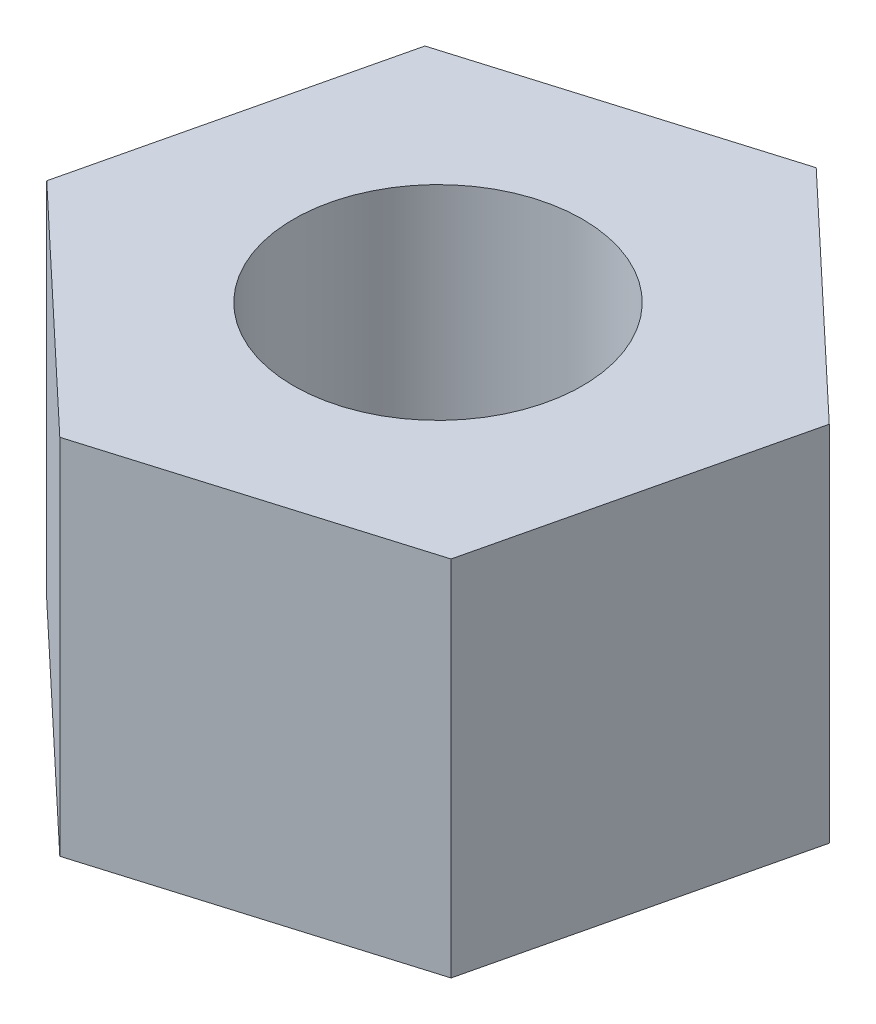
ISO-10303-21;
HEADER;
FILE_DESCRIPTION(('STEP AP214'),'2;1');
FILE_NAME('part.step','',(''),(''),'','','');
FILE_SCHEMA(('AUTOMOTIVE_DESIGN { 1 0 10303 214 1 1 1 1 }'));
ENDSEC;
DATA;
#1=APPLICATION_CONTEXT('core data for automotive mechanical design processes');
#2=APPLICATION_PROTOCOL_DEFINITION('international standard','automotive_design',2000,#1);
#3=PRODUCT_CONTEXT('',#1,'mechanical');
#4=PRODUCT('Part','Part','',(#3));
#5=PRODUCT_RELATED_PRODUCT_CATEGORY('part','',(#4));
#6=PRODUCT_DEFINITION_FORMATION('','',#4);
#7=PRODUCT_DEFINITION_CONTEXT('part definition',#1,'design');
#8=PRODUCT_DEFINITION('design','',#6,#7);
#9=PRODUCT_DEFINITION_SHAPE('','',#8);
#10=(LENGTH_UNIT() NAMED_UNIT(*) SI_UNIT(.MILLI.,.METRE.));
#11=(NAMED_UNIT(*) PLANE_ANGLE_UNIT() SI_UNIT($,.RADIAN.));
#12=(NAMED_UNIT(*) SI_UNIT($,.STERADIAN.) SOLID_ANGLE_UNIT());
#13=UNCERTAINTY_MEASURE_WITH_UNIT(LENGTH_MEASURE(1.E-05),#10,'distance_accuracy_value','');
#14=(GEOMETRIC_REPRESENTATION_CONTEXT(3) GLOBAL_UNCERTAINTY_ASSIGNED_CONTEXT((#13)) GLOBAL_UNIT_ASSIGNED_CONTEXT((#10,
#11,#12)) REPRESENTATION_CONTEXT('',''));
#15=CARTESIAN_POINT('',(0.,0.,0.));
#16=DIRECTION('',(0.,0.,1.));
#17=DIRECTION('',(1.,0.,0.));
#18=AXIS2_PLACEMENT_3D('',#15,#16,#17);
#19=CARTESIAN_POINT('',(-14.1600665091163,6.35,0.435661310979104));
#20=DIRECTION('',(-0.287104474936416,0.,-0.957899274700365));
#21=DIRECTION('',(-0.957899274700365,0.,0.287104474936416));
#22=AXIS2_PLACEMENT_3D('',#19,#20,#21);
#23=PLANE('',#22);
#24=DIRECTION('',(0.957899274700365,0.,-0.287104474936416));
#25=VECTOR('',#24,1.);
#26=CARTESIAN_POINT('',(-14.1600665091163,0.,0.435661310979104));
#27=LINE('',#26,#25);
#28=CARTESIAN_POINT('',(-14.1600665091163,0.,0.435661310979104));
#29=VERTEX_POINT('',#28);
#30=CARTESIAN_POINT('',(-8.89232808501804,0.,-1.14320122112396));
#31=VERTEX_POINT('',#30);
#32=EDGE_CURVE('E120',#29,#31,#27,.T.);
#33=ORIENTED_EDGE('',*,*,#32,.T.);
#34=DIRECTION('',(0.,-1.,0.));
#35=VECTOR('',#34,1.);
#36=CARTESIAN_POINT('',(-8.89232808501804,6.35,-1.14320122112396));
#37=LINE('',#36,#35);
#38=CARTESIAN_POINT('',(-8.89232808501804,6.35,-1.14320122112396));
#39=VERTEX_POINT('',#38);
#40=EDGE_CURVE('E11',#39,#31,#37,.T.);
#41=ORIENTED_EDGE('',*,*,#40,.F.);
#42=DIRECTION('',(0.957899274700365,0.,-0.287104474936416));
#43=VECTOR('',#42,1.);
#44=CARTESIAN_POINT('',(-14.1600665091163,6.35,0.435661310979104));
#45=LINE('',#44,#43);
#46=CARTESIAN_POINT('',(-14.1600665091163,6.35,0.435661310979104));
#47=VERTEX_POINT('',#46);
#48=EDGE_CURVE('E131',#47,#39,#45,.T.);
#49=ORIENTED_EDGE('',*,*,#48,.F.);
#50=DIRECTION('',(0.,-1.,0.));
#51=VECTOR('',#50,1.);
#52=CARTESIAN_POINT('',(-14.1600665091163,6.35,0.435661310979104));
#53=LINE('',#52,#51);
#54=EDGE_CURVE('E116',#47,#29,#53,.T.);
#55=ORIENTED_EDGE('',*,*,#54,.T.);
#56=EDGE_LOOP('',(#33,#41,#49,#55));
#57=FACE_BOUND('',#56,.T.);
#58=ADVANCED_FACE('F36',(#57),#23,.F.);
#59=CARTESIAN_POINT('',(-8.89232808501804,6.35,-1.14320122112396));
#60=DIRECTION('',(-0.973117343625412,0.,-0.230309868515055));
#61=DIRECTION('',(-0.230309868515055,0.,0.973117343625412));
#62=AXIS2_PLACEMENT_3D('',#59,#60,#61);
#63=PLANE('',#62);
#64=DIRECTION('',(0.230309868515055,0.,-0.973117343625412));
#65=VECTOR('',#64,1.);
#66=CARTESIAN_POINT('',(-8.89232808501804,0.,-1.14320122112396));
#67=LINE('',#66,#65);
#68=CARTESIAN_POINT('',(-7.62579393485359,0.,-6.49462778293599));
#69=VERTEX_POINT('',#68);
#70=EDGE_CURVE('E123',#31,#69,#67,.T.);
#71=ORIENTED_EDGE('',*,*,#70,.T.);
#72=DIRECTION('',(0.,-1.,0.));
#73=VECTOR('',#72,1.);
#74=CARTESIAN_POINT('',(-7.62579393485359,6.35,-6.49462778293599));
#75=LINE('',#74,#73);
#76=CARTESIAN_POINT('',(-7.62579393485359,6.35,-6.49462778293599));
#77=VERTEX_POINT('',#76);
#78=EDGE_CURVE('E44',#77,#69,#75,.T.);
#79=ORIENTED_EDGE('',*,*,#78,.F.);
#80=DIRECTION('',(0.230309868515055,0.,-0.973117343625412));
#81=VECTOR('',#80,1.);
#82=CARTESIAN_POINT('',(-8.89232808501804,6.35,-1.14320122112396));
#83=LINE('',#82,#81);
#84=EDGE_CURVE('E89',#39,#77,#83,.T.);
#85=ORIENTED_EDGE('',*,*,#84,.F.);
#86=ORIENTED_EDGE('',*,*,#40,.T.);
#87=EDGE_LOOP('',(#71,#79,#85,#86));
#88=FACE_BOUND('',#87,.T.);
#89=ADVANCED_FACE('F156',(#88),#63,.F.);
#90=CARTESIAN_POINT('',(-7.62579393485359,6.35,-6.49462778293599));
#91=DIRECTION('',(-0.686012868688996,0.,0.727589406185311));
#92=DIRECTION('',(0.727589406185311,0.,0.686012868688996));
#93=AXIS2_PLACEMENT_3D('',#90,#91,#92);
#94=PLANE('',#93);
#95=DIRECTION('',(-0.727589406185311,0.,-0.686012868688996));
#96=VECTOR('',#95,1.);
#97=CARTESIAN_POINT('',(-7.62579393485359,0.,-6.49462778293599));
#98=LINE('',#97,#96);
#99=CARTESIAN_POINT('',(-11.6269982087874,0.,-10.2671918126449));
#100=VERTEX_POINT('',#99);
#101=EDGE_CURVE('E126',#69,#100,#98,.T.);
#102=ORIENTED_EDGE('',*,*,#101,.T.);
#103=DIRECTION('',(0.,-1.,0.));
#104=VECTOR('',#103,1.);
#105=CARTESIAN_POINT('',(-11.6269982087874,6.35,-10.2671918126449));
#106=LINE('',#105,#104);
#107=CARTESIAN_POINT('',(-11.6269982087874,6.35,-10.2671918126449));
#108=VERTEX_POINT('',#107);
#109=EDGE_CURVE('E111',#108,#100,#106,.T.);
#110=ORIENTED_EDGE('',*,*,#109,.F.);
#111=DIRECTION('',(-0.727589406185311,0.,-0.686012868688996));
#112=VECTOR('',#111,1.);
#113=CARTESIAN_POINT('',(-7.62579393485359,6.35,-6.49462778293599));
#114=LINE('',#113,#112);
#115=EDGE_CURVE('E102',#77,#108,#114,.T.);
#116=ORIENTED_EDGE('',*,*,#115,.F.);
#117=ORIENTED_EDGE('',*,*,#78,.T.);
#118=EDGE_LOOP('',(#102,#110,#116,#117));
#119=FACE_BOUND('',#118,.T.);
#120=ADVANCED_FACE('F137',(#119),#94,.F.);
#121=CARTESIAN_POINT('',(-11.6269982087874,6.35,-10.2671918126449));
#122=DIRECTION('',(0.287104474936417,0.,0.957899274700364));
#123=DIRECTION('',(0.957899274700365,0.,-0.287104474936417));
#124=AXIS2_PLACEMENT_3D('',#121,#122,#123);
#125=PLANE('',#124);
#126=DIRECTION('',(-0.957899274700365,0.,0.287104474936417));
#127=VECTOR('',#126,1.);
#128=CARTESIAN_POINT('',(-11.6269982087874,0.,-10.2671918126449));
#129=LINE('',#128,#127);
#130=CARTESIAN_POINT('',(-16.8947366328856,0.,-8.68832928054187));
#131=VERTEX_POINT('',#130);
#132=EDGE_CURVE('E110',#100,#131,#129,.T.);
#133=ORIENTED_EDGE('',*,*,#132,.T.);
#134=DIRECTION('',(0.,-1.,0.));
#135=VECTOR('',#134,1.);
#136=CARTESIAN_POINT('',(-16.8947366328856,6.35,-8.68832928054187));
#137=LINE('',#136,#135);
#138=CARTESIAN_POINT('',(-16.8947366328856,6.35,-8.68832928054187));
#139=VERTEX_POINT('',#138);
#140=EDGE_CURVE('E107',#139,#131,#137,.T.);
#141=ORIENTED_EDGE('',*,*,#140,.F.);
#142=DIRECTION('',(-0.957899274700365,0.,0.287104474936417));
#143=VECTOR('',#142,1.);
#144=CARTESIAN_POINT('',(-11.6269982087874,6.35,-10.2671918126449));
#145=LINE('',#144,#143);
#146=EDGE_CURVE('E96',#108,#139,#145,.T.);
#147=ORIENTED_EDGE('',*,*,#146,.F.);
#148=ORIENTED_EDGE('',*,*,#109,.T.);
#149=EDGE_LOOP('',(#133,#141,#147,#148));
#150=FACE_BOUND('',#149,.T.);
#151=ADVANCED_FACE('F108',(#150),#125,.F.);
#152=CARTESIAN_POINT('',(-16.8947366328856,6.35,-8.68832928054187));
#153=DIRECTION('',(0.973117343625412,0.,0.230309868515054));
#154=DIRECTION('',(0.230309868515054,0.,-0.973117343625412));
#155=AXIS2_PLACEMENT_3D('',#152,#153,#154);
#156=PLANE('',#155);
#157=DIRECTION('',(-0.230309868515054,0.,0.973117343625412));
#158=VECTOR('',#157,1.);
#159=CARTESIAN_POINT('',(-16.8947366328856,0.,-8.68832928054187));
#160=LINE('',#159,#158);
#161=CARTESIAN_POINT('',(-18.1612707830501,0.,-3.33690271872985));
#162=VERTEX_POINT('',#161);
#163=EDGE_CURVE('E75',#131,#162,#160,.T.);
#164=ORIENTED_EDGE('',*,*,#163,.T.);
#165=DIRECTION('',(0.,-1.,0.));
#166=VECTOR('',#165,1.);
#167=CARTESIAN_POINT('',(-18.1612707830501,6.35,-3.33690271872985));
#168=LINE('',#167,#166);
#169=CARTESIAN_POINT('',(-18.1612707830501,6.35,-3.33690271872985));
#170=VERTEX_POINT('',#169);
#171=EDGE_CURVE('E112',#170,#162,#168,.T.);
#172=ORIENTED_EDGE('',*,*,#171,.F.);
#173=DIRECTION('',(-0.230309868515054,0.,0.973117343625412));
#174=VECTOR('',#173,1.);
#175=CARTESIAN_POINT('',(-16.8947366328856,6.35,-8.68832928054187));
#176=LINE('',#175,#174);
#177=EDGE_CURVE('E100',#139,#170,#176,.T.);
#178=ORIENTED_EDGE('',*,*,#177,.F.);
#179=ORIENTED_EDGE('',*,*,#140,.T.);
#180=EDGE_LOOP('',(#164,#172,#178,#179));
#181=FACE_BOUND('',#180,.T.);
#182=ADVANCED_FACE('F114',(#181),#156,.F.);
#183=CARTESIAN_POINT('',(-18.1612707830501,6.35,-3.33690271872985));
#184=DIRECTION('',(0.686012868688996,0.,-0.727589406185311));
#185=DIRECTION('',(-0.727589406185311,0.,-0.686012868688997));
#186=AXIS2_PLACEMENT_3D('',#183,#184,#185);
#187=PLANE('',#186);
#188=DIRECTION('',(0.727589406185311,0.,0.686012868688997));
#189=VECTOR('',#188,1.);
#190=CARTESIAN_POINT('',(-18.1612707830501,0.,-3.33690271872985));
#191=LINE('',#190,#189);
#192=EDGE_CURVE('E81',#162,#29,#191,.T.);
#193=ORIENTED_EDGE('',*,*,#192,.T.);
#194=ORIENTED_EDGE('',*,*,#54,.F.);
#195=DIRECTION('',(0.727589406185311,0.,0.686012868688997));
#196=VECTOR('',#195,1.);
#197=CARTESIAN_POINT('',(-18.1612707830501,6.35,-3.33690271872985));
#198=LINE('',#197,#196);
#199=EDGE_CURVE('E52',#170,#47,#198,.T.);
#200=ORIENTED_EDGE('',*,*,#199,.F.);
#201=ORIENTED_EDGE('',*,*,#171,.T.);
#202=EDGE_LOOP('',(#193,#194,#200,#201));
#203=FACE_BOUND('',#202,.T.);
#204=ADVANCED_FACE('F144',(#203),#187,.F.);
#205=CARTESIAN_POINT('',(0.,6.35,0.));
#206=DIRECTION('',(0.,1.,0.));
#207=DIRECTION('',(0.,0.,1.));
#208=AXIS2_PLACEMENT_3D('',#205,#206,#207);
#209=PLANE('',#208);
#210=CARTESIAN_POINT('',(-12.8935323589518,6.35,-4.91576525083292));
#211=DIRECTION('',(0.,1.,0.));
#212=DIRECTION('',(0.,0.,1.));
#213=AXIS2_PLACEMENT_3D('',#210,#211,#212);
#214=CIRCLE('',#213,2.5273);
#215=CARTESIAN_POINT('',(-12.8935323589518,6.35,-2.38846525083292));
#216=VERTEX_POINT('',#215);
#217=EDGE_CURVE('E243',#216,#216,#214,.T.);
#218=ORIENTED_EDGE('',*,*,#217,.F.);
#219=EDGE_LOOP('',(#218));
#220=FACE_BOUND('',#219,.T.);
#221=ORIENTED_EDGE('',*,*,#48,.T.);
#222=ORIENTED_EDGE('',*,*,#84,.T.);
#223=ORIENTED_EDGE('',*,*,#115,.T.);
#224=ORIENTED_EDGE('',*,*,#146,.T.);
#225=ORIENTED_EDGE('',*,*,#177,.T.);
#226=ORIENTED_EDGE('',*,*,#199,.T.);
#227=EDGE_LOOP('',(#221,#222,#223,#224,#225,#226));
#228=FACE_BOUND('',#227,.T.);
#229=ADVANCED_FACE('F98',(#220,#228),#209,.T.);
#230=CARTESIAN_POINT('',(0.,0.,0.));
#231=DIRECTION('',(0.,1.,0.));
#232=DIRECTION('',(0.,0.,1.));
#233=AXIS2_PLACEMENT_3D('',#230,#231,#232);
#234=PLANE('',#233);
#235=CARTESIAN_POINT('',(-12.8935323589518,0.,-4.91576525083292));
#236=DIRECTION('',(0.,1.,0.));
#237=DIRECTION('',(0.,0.,1.));
#238=AXIS2_PLACEMENT_3D('',#235,#236,#237);
#239=CIRCLE('',#238,2.5273);
#240=CARTESIAN_POINT('',(-12.8935323589518,0.,-2.38846525083292));
#241=VERTEX_POINT('',#240);
#242=EDGE_CURVE('E124',#241,#241,#239,.T.);
#243=ORIENTED_EDGE('',*,*,#242,.T.);
#244=EDGE_LOOP('',(#243));
#245=FACE_BOUND('',#244,.T.);
#246=ORIENTED_EDGE('',*,*,#32,.F.);
#247=ORIENTED_EDGE('',*,*,#192,.F.);
#248=ORIENTED_EDGE('',*,*,#163,.F.);
#249=ORIENTED_EDGE('',*,*,#132,.F.);
#250=ORIENTED_EDGE('',*,*,#101,.F.);
#251=ORIENTED_EDGE('',*,*,#70,.F.);
#252=EDGE_LOOP('',(#246,#247,#248,#249,#250,#251));
#253=FACE_BOUND('',#252,.T.);
#254=ADVANCED_FACE('F140',(#245,#253),#234,.F.);
#255=CARTESIAN_POINT('',(-12.8935323589518,6.35,-4.91576525083292));
#256=DIRECTION('',(0.,1.,0.));
#257=DIRECTION('',(0.,0.,1.));
#258=AXIS2_PLACEMENT_3D('',#255,#256,#257);
#259=CYLINDRICAL_SURFACE('',#258,2.5273);
#260=ORIENTED_EDGE('',*,*,#242,.F.);
#261=EDGE_LOOP('',(#260));
#262=FACE_BOUND('',#261,.T.);
#263=ORIENTED_EDGE('',*,*,#217,.T.);
#264=EDGE_LOOP('',(#263));
#265=FACE_BOUND('',#264,.T.);
#266=ADVANCED_FACE('F193',(#262,#265),#259,.F.);
#267=CLOSED_SHELL('',(#58,#89,#120,#151,#182,#204,#229,#254,#266));
#268=MANIFOLD_SOLID_BREP('B2',#267);
#269=ADVANCED_BREP_SHAPE_REPRESENTATION('',(#18,#268),#14);
#270=SHAPE_DEFINITION_REPRESENTATION(#9,#269);
ENDSEC;
END-ISO-10303-21;
